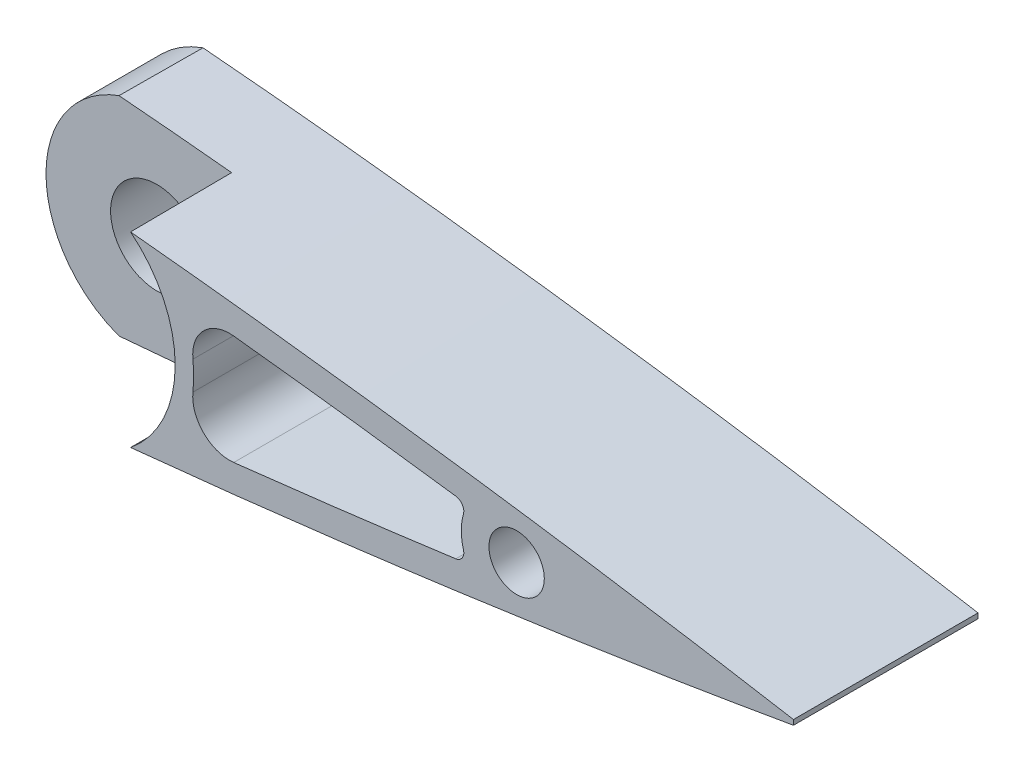
ISO-10303-21;
HEADER;
FILE_DESCRIPTION(('STEP AP214'),'2;1');
FILE_NAME('part.step','',(''),(''),'','','');
FILE_SCHEMA(('AUTOMOTIVE_DESIGN { 1 0 10303 214 1 1 1 1 }'));
ENDSEC;
DATA;
#1=APPLICATION_CONTEXT('core data for automotive mechanical design processes');
#2=APPLICATION_PROTOCOL_DEFINITION('international standard','automotive_design',2000,#1);
#3=PRODUCT_CONTEXT('',#1,'mechanical');
#4=PRODUCT('Part','Part','',(#3));
#5=PRODUCT_RELATED_PRODUCT_CATEGORY('part','',(#4));
#6=PRODUCT_DEFINITION_FORMATION('','',#4);
#7=PRODUCT_DEFINITION_CONTEXT('part definition',#1,'design');
#8=PRODUCT_DEFINITION('design','',#6,#7);
#9=PRODUCT_DEFINITION_SHAPE('','',#8);
#10=(LENGTH_UNIT() NAMED_UNIT(*) SI_UNIT(.MILLI.,.METRE.));
#11=(NAMED_UNIT(*) PLANE_ANGLE_UNIT() SI_UNIT($,.RADIAN.));
#12=(NAMED_UNIT(*) SI_UNIT($,.STERADIAN.) SOLID_ANGLE_UNIT());
#13=UNCERTAINTY_MEASURE_WITH_UNIT(LENGTH_MEASURE(1.E-05),#10,'distance_accuracy_value','');
#14=(GEOMETRIC_REPRESENTATION_CONTEXT(3) GLOBAL_UNCERTAINTY_ASSIGNED_CONTEXT((#13)) GLOBAL_UNIT_ASSIGNED_CONTEXT((#10,
#11,#12)) REPRESENTATION_CONTEXT('',''));
#15=CARTESIAN_POINT('',(0.,0.,0.));
#16=DIRECTION('',(0.,0.,1.));
#17=DIRECTION('',(1.,0.,0.));
#18=AXIS2_PLACEMENT_3D('',#15,#16,#17);
#19=CARTESIAN_POINT('',(-40.9948576917224,5.65866970142062,0.));
#20=CARTESIAN_POINT('',(-41.1047681248967,5.61871436722129,10.));
#21=CARTESIAN_POINT('',(-47.4055594104204,3.39869725070977,0.));
#22=CARTESIAN_POINT('',(-47.2891726596624,3.30203893481651,10.));
#23=CARTESIAN_POINT('',(-47.4055594105346,-3.39869725042733,0.));
#24=CARTESIAN_POINT('',(-47.2891726596455,-3.30203893485913,10.));
#25=CARTESIAN_POINT('',(-40.9948576919126,-5.6586697013536,0.));
#26=CARTESIAN_POINT('',(-41.1047681248678,-5.61871436723212,10.));
#27=(BOUNDED_SURFACE() B_SPLINE_SURFACE(3,1,((#19,#20),(#21,#22),(#23,#24),(#25,#26)),
.UNSPECIFIED.,.F.,.F.,.F.) B_SPLINE_SURFACE_WITH_KNOTS((4,4),(2,2),(0.,1.),(0.,1.),
.UNSPECIFIED.) GEOMETRIC_REPRESENTATION_ITEM() RATIONAL_B_SPLINE_SURFACE(((1.,1.),
(0.554984187979723,0.567196458320245),(0.554984187979723,0.567196458320245),(1.,1.))) REPRESENTATION_ITEM('') SURFACE());
#28=DIRECTION('',(-0.0109902917648385,0.00399526021097337,0.999931623353702));
#29=VECTOR('',#28,1.);
#30=CARTESIAN_POINT('',(-41.0498129083902,-5.63869203429286,5.));
#31=LINE('',#30,#29);
#32=CARTESIAN_POINT('',(-40.9948576919126,-5.65866970135359,0.));
#33=VERTEX_POINT('',#32);
#34=CARTESIAN_POINT('',(-41.0443173867424,-5.64068980099893,4.5));
#35=VERTEX_POINT('',#34);
#36=EDGE_CURVE('E447',#33,#35,#31,.T.);
#37=CARTESIAN_POINT('',(-41.0443173867424,-5.64068980099893,4.5));
#38=CARTESIAN_POINT('',(-41.2029787283233,-5.58321266238251,4.5));
#39=CARTESIAN_POINT('',(-41.3592000566172,-5.51900992495319,4.5));
#40=CARTESIAN_POINT('',(-41.6656772125908,-5.37768582411472,4.5));
#41=CARTESIAN_POINT('',(-41.8159333240919,-5.30056507625015,4.5));
#42=CARTESIAN_POINT('',(-42.1093073917876,-5.13399014906312,4.5));
#43=CARTESIAN_POINT('',(-42.2524302609352,-5.04454462273975,4.5));
#44=CARTESIAN_POINT('',(-42.5306341271626,-4.85392084998433,4.5));
#45=CARTESIAN_POINT('',(-42.665715222412,-4.75274274682159,4.5));
#46=CARTESIAN_POINT('',(-42.9269145382488,-4.53933954442495,4.5));
#47=CARTESIAN_POINT('',(-43.0530301734367,-4.42711128069352,4.5));
#48=CARTESIAN_POINT('',(-43.2954042491617,-4.19238665314542,4.5));
#49=CARTESIAN_POINT('',(-43.4116590306164,-4.06988651096669,4.5));
#50=CARTESIAN_POINT('',(-43.6333689978865,-3.8155975353294,4.5));
#51=CARTESIAN_POINT('',(-43.7388302788178,-3.68381401600102,4.5));
#52=CARTESIAN_POINT('',(-43.9383158222019,-3.41178267756264,4.5));
#53=CARTESIAN_POINT('',(-44.0323358493603,-3.27153175257937,4.5));
#54=CARTESIAN_POINT('',(-44.2081909822555,-2.98366226584791,4.5));
#55=CARTESIAN_POINT('',(-44.2900307477082,-2.83604655060197,4.5));
#56=CARTESIAN_POINT('',(-44.441014675281,-2.53439099852572,4.5));
#57=CARTESIAN_POINT('',(-44.5101541387605,-2.38034880989819,4.5));
#58=CARTESIAN_POINT('',(-44.635194859,-2.06702054593191,4.5));
#59=CARTESIAN_POINT('',(-44.6910989573736,-1.90773560458457,4.5));
#60=CARTESIAN_POINT('',(-44.7893086837632,-1.58496311407236,4.5));
#61=CARTESIAN_POINT('',(-44.8316092982534,-1.42147403940422,4.5));
#62=CARTESIAN_POINT('',(-44.9022668839468,-1.09158759943807,4.5));
#63=CARTESIAN_POINT('',(-44.9306301614375,-0.925191584814896,4.5));
#64=CARTESIAN_POINT('',(-44.9732474822588,-0.59054354297316,4.5));
#65=CARTESIAN_POINT('',(-44.9874966167167,-0.422290890577029,4.5));
#66=CARTESIAN_POINT('',(-45.0017653727376,-0.0852222494450081,4.5));
#67=CARTESIAN_POINT('',(-45.0017882773243,0.0835936003277888,4.5));
#68=CARTESIAN_POINT('',(-44.9876126431121,0.420627145444089,4.5));
#69=CARTESIAN_POINT('',(-44.9734141044544,0.588844840793534,4.5));
#70=CARTESIAN_POINT('',(-44.9308922323424,0.923520080554931,4.5));
#71=CARTESIAN_POINT('',(-44.90256604068,1.08997726183005,4.5));
#72=CARTESIAN_POINT('',(-44.83200127376,1.4198555460239,4.5));
#73=CARTESIAN_POINT('',(-44.7897675378456,1.5832776841661,4.5));
#74=CARTESIAN_POINT('',(-44.6916699506041,1.90603451970287,4.5));
#75=CARTESIAN_POINT('',(-44.6358018383275,2.06536792206897,4.5));
#76=CARTESIAN_POINT('',(-44.5108627948793,2.37870331303613,4.5));
#77=CARTESIAN_POINT('',(-44.44179672924,2.53270724175574,4.5));
#78=CARTESIAN_POINT('',(-44.2909231243759,2.83438356239696,4.5));
#79=CARTESIAN_POINT('',(-44.2091128442862,2.98205458358372,4.5));
#80=CARTESIAN_POINT('',(-44.033375820723,3.26992687955399,4.5));
#81=CARTESIAN_POINT('',(-43.939453557196,3.41013088925647,4.5));
#82=CARTESIAN_POINT('',(-43.7400621650187,3.6822332701832,4.5));
#83=CARTESIAN_POINT('',(-43.6345844985867,3.81412538522285,4.5));
#84=CARTESIAN_POINT('',(-43.4129308672798,4.06850496041743,4.5));
#85=CARTESIAN_POINT('',(-43.2967588659963,4.19099587427633,4.5));
#86=CARTESIAN_POINT('',(-43.0543755064491,4.42588647736764,4.5));
#87=CARTESIAN_POINT('',(-42.928153163707,4.53827483144716,4.5));
#88=CARTESIAN_POINT('',(-42.6667285449148,4.75196711716739,4.5));
#89=CARTESIAN_POINT('',(-42.5315296836153,4.85327522544987,4.5));
#90=CARTESIAN_POINT('',(-42.253260266547,5.04400768802192,4.5));
#91=CARTESIAN_POINT('',(-42.1102001920476,5.13344734764898,4.5));
#92=CARTESIAN_POINT('',(-41.8171169893318,5.29992861466415,4.5));
#93=CARTESIAN_POINT('',(-41.6670976529211,5.37697687370584,4.5));
#94=CARTESIAN_POINT('',(-41.4371842338413,5.48307626733985,4.5));
#95=CARTESIAN_POINT('',(-41.3594839707452,5.51695399823137,4.5));
#96=CARTESIAN_POINT('',(-41.2028335005848,5.5813412028403,4.5));
#97=CARTESIAN_POINT('',(-41.1238852956492,5.61185554763173,4.5));
#98=CARTESIAN_POINT('',(-41.0443173866508,5.64068980103092,4.5));
#99=B_SPLINE_CURVE_WITH_KNOTS('',3,(#37,#38,#39,#40,#41,#42,#43,#44,#45,#46,#47,#48,#49,#50,#51,
#52,#53,#54,#55,#56,#57,#58,#59,#60,#61,#62,#63,#64,#65,#66,#67,#68,#69,#70,#71,#72,#73,#74,#75,
#76,#77,#78,#79,#80,#81,#82,#83,#84,#85,#86,#87,#88,#89,#90,#91,#92,#93,#94,#95,#96,#97,#98),
.UNSPECIFIED.,.F.,.F.,(4,2,2,2,2,2,2,2,2,2,2,2,2,2,2,2,2,2,2,2,2,2,2,2,2,2,2,2,2,2,4),(0.,
0.506099776824991,1.01217544479851,1.51789759980682,2.02361357997118,2.52947480847549,
3.03552293391158,3.54128369743823,4.04723111633107,4.55298447822737,5.05892457490393,
5.56475594827675,6.07077353130984,6.57656194305414,7.08252620536402,7.5883737049542,
8.09422119951962,8.60017107515931,9.1059450834955,9.61187735674933,10.1176234725583,
10.6234785084119,11.129146973813,11.6351916079481,12.1410494384919,12.6474679400463,
13.1536948870201,13.6592625336143,14.1645578811373,14.4187857783768,14.6726405095199),.UNSPECIFIED.);
#100=CARTESIAN_POINT('',(-41.0443173866508,5.64068980103092,4.5));
#101=VERTEX_POINT('',#100);
#102=EDGE_CURVE('E341',#35,#101,#99,.T.);
#103=DIRECTION('',(0.0109902917867373,0.00399526021875701,-0.999931623353431));
#104=VECTOR('',#103,1.);
#105=CARTESIAN_POINT('',(-41.0498129083095,5.63869203432095,5.));
#106=LINE('',#105,#104);
#107=CARTESIAN_POINT('',(-40.9948576917224,5.65866970142062,0.));
#108=VERTEX_POINT('',#107);
#109=EDGE_CURVE('E221',#101,#108,#106,.T.);
#110=CARTESIAN_POINT('',(-39.,0.,0.));
#111=DIRECTION('',(0.,0.,1.));
#112=DIRECTION('',(1.,0.,0.));
#113=AXIS2_PLACEMENT_3D('',#110,#111,#112);
#114=CIRCLE('',#113,6.);
#115=EDGE_CURVE('E460',#108,#33,#114,.T.);
#116=ORIENTED_EDGE('',*,*,#36,.T.);
#117=ORIENTED_EDGE('',*,*,#102,.T.);
#118=ORIENTED_EDGE('',*,*,#109,.T.);
#119=ORIENTED_EDGE('',*,*,#115,.T.);
#120=EDGE_LOOP('',(#116,#117,#118,#119));
#121=FACE_BOUND('',#120,.T.);
#122=ADVANCED_FACE('F72',(#121),#27,.T.);
#123=CARTESIAN_POINT('',(-19.9933945924361,3.33135373290167,10.));
#124=DIRECTION('',(0.,0.,-1.));
#125=DIRECTION('',(-1.,0.,0.));
#126=AXIS2_PLACEMENT_3D('',#123,#124,#125);
#127=PLANE('',#126);
#128=CARTESIAN_POINT('',(-13.9999999999735,0.,10.));
#129=DIRECTION('',(0.,0.,-1.));
#130=DIRECTION('',(1.,0.,0.));
#131=AXIS2_PLACEMENT_3D('',#128,#129,#130);
#132=CIRCLE('',#131,3.);
#133=CARTESIAN_POINT('',(-16.8813350390833,-0.835409116779079,10.));
#134=VERTEX_POINT('',#133);
#135=CARTESIAN_POINT('',(-16.8813350390833,0.83540911677908,10.));
#136=VERTEX_POINT('',#135);
#137=EDGE_CURVE('E730',#134,#136,#132,.T.);
#138=ORIENTED_EDGE('',*,*,#137,.F.);
#139=CARTESIAN_POINT('',(-17.3615575456018,-0.974643969575621,10.));
#140=DIRECTION('',(0.,0.,-1.));
#141=DIRECTION('',(-1.,0.,0.));
#142=AXIS2_PLACEMENT_3D('',#139,#140,#141);
#143=CIRCLE('',#142,0.5);
#144=CARTESIAN_POINT('',(-17.2940529128367,-1.47007116894763,10.));
#145=VERTEX_POINT('',#144);
#146=EDGE_CURVE('E785',#134,#145,#143,.T.);
#147=ORIENTED_EDGE('',*,*,#146,.T.);
#148=CARTESIAN_POINT('',(-32.2583801629089,-3.28642084534359,10.));
#149=CARTESIAN_POINT('',(-30.0355019119028,-3.05174208210174,10.));
#150=CARTESIAN_POINT('',(-24.9412271101502,-2.47464776327198,10.));
#151=CARTESIAN_POINT('',(-19.7462553883482,-1.80661306170258,10.));
#152=CARTESIAN_POINT('',(-16.7717452962424,-1.39864830717587,10.));
#153=CARTESIAN_POINT('',(-16.6619182883872,-1.38355031796397,10.));
#154=B_SPLINE_CURVE_WITH_KNOTS('',3,(#148,#149,#150,#151,#152,#153),.UNSPECIFIED.,.F.,.F.,(4,1,
1,4),(0.0966403573735884,0.134580830221984,0.183660771534481,0.185542495339951),.UNSPECIFIED.);
#155=CARTESIAN_POINT('',(-29.3277461781608,-2.9674023842486,10.));
#156=VERTEX_POINT('',#155);
#157=EDGE_CURVE('E76',#145,#156,#154,.F.);
#158=ORIENTED_EDGE('',*,*,#157,.T.);
#159=CARTESIAN_POINT('',(-29.5506570415579,-0.979753874506312,10.));
#160=DIRECTION('',(0.,0.,-1.));
#161=DIRECTION('',(-1.,0.,0.));
#162=AXIS2_PLACEMENT_3D('',#159,#160,#161);
#163=CIRCLE('',#162,2.);
#164=CARTESIAN_POINT('',(-31.5399924012203,-0.773489900926037,10.));
#165=VERTEX_POINT('',#164);
#166=EDGE_CURVE('E83',#156,#165,#163,.T.);
#167=ORIENTED_EDGE('',*,*,#166,.T.);
#168=CARTESIAN_POINT('',(-38.999999999954,0.,10.));
#169=DIRECTION('',(0.,0.,-1.));
#170=DIRECTION('',(1.,0.,0.));
#171=AXIS2_PLACEMENT_3D('',#168,#169,#170);
#172=CIRCLE('',#171,7.5);
#173=CARTESIAN_POINT('',(-31.5399924012203,0.773489900926035,10.));
#174=VERTEX_POINT('',#173);
#175=EDGE_CURVE('E740',#174,#165,#172,.T.);
#176=ORIENTED_EDGE('',*,*,#175,.F.);
#177=CARTESIAN_POINT('',(-29.5506570415579,0.979753874506312,10.));
#178=DIRECTION('',(0.,0.,-1.));
#179=DIRECTION('',(-1.,0.,0.));
#180=AXIS2_PLACEMENT_3D('',#177,#178,#179);
#181=CIRCLE('',#180,2.);
#182=CARTESIAN_POINT('',(-29.3277461781608,2.9674023842486,10.));
#183=VERTEX_POINT('',#182);
#184=EDGE_CURVE('E826',#174,#183,#181,.T.);
#185=ORIENTED_EDGE('',*,*,#184,.T.);
#186=CARTESIAN_POINT('',(-16.6619182883872,1.38355031796397,10.));
#187=CARTESIAN_POINT('',(-16.7717452962424,1.39864830717587,10.));
#188=CARTESIAN_POINT('',(-19.7462553883482,1.80661306170258,10.));
#189=CARTESIAN_POINT('',(-24.9412271101502,2.47464776327198,10.));
#190=CARTESIAN_POINT('',(-30.0355019119028,3.05174208210174,10.));
#191=CARTESIAN_POINT('',(-32.2583801629089,3.28642084534359,10.));
#192=B_SPLINE_CURVE_WITH_KNOTS('',3,(#186,#187,#188,#189,#190,#191),.UNSPECIFIED.,.F.,.F.,(4,1,
1,4),(0.0966403573735884,0.0985220811790582,0.147602022491555,0.185542495339951),.UNSPECIFIED.);
#193=CARTESIAN_POINT('',(-17.2940529128367,1.47007116894762,10.));
#194=VERTEX_POINT('',#193);
#195=EDGE_CURVE('E269',#183,#194,#192,.F.);
#196=ORIENTED_EDGE('',*,*,#195,.T.);
#197=CARTESIAN_POINT('',(-17.3615575456017,0.974643969575606,10.));
#198=DIRECTION('',(0.,0.,-1.));
#199=DIRECTION('',(-1.,0.,0.));
#200=AXIS2_PLACEMENT_3D('',#197,#198,#199);
#201=CIRCLE('',#200,0.5);
#202=EDGE_CURVE('E776',#194,#136,#201,.T.);
#203=ORIENTED_EDGE('',*,*,#202,.T.);
#204=EDGE_LOOP('',(#138,#147,#158,#167,#176,#185,#196,#203));
#205=FACE_BOUND('',#204,.T.);
#206=CARTESIAN_POINT('',(-13.9999999999735,0.,10.));
#207=DIRECTION('',(0.,0.,1.));
#208=DIRECTION('',(1.,0.,0.));
#209=AXIS2_PLACEMENT_3D('',#206,#207,#208);
#210=CIRCLE('',#209,1.5);
#211=CARTESIAN_POINT('',(-12.4999999999734,0.,10.));
#212=VERTEX_POINT('',#211);
#213=EDGE_CURVE('E326',#212,#212,#210,.T.);
#214=ORIENTED_EDGE('',*,*,#213,.F.);
#215=EDGE_LOOP('',(#214));
#216=FACE_BOUND('',#215,.T.);
#217=CARTESIAN_POINT('',(1.00000000002645,0.135879999995553,10.));
#218=CARTESIAN_POINT('',(-0.43285857392012,0.382390442065448,10.));
#219=CARTESIAN_POINT('',(-3.29636544570968,0.875031068063019,10.));
#220=CARTESIAN_POINT('',(-9.02673756327685,1.79088543213333,10.));
#221=CARTESIAN_POINT('',(-16.1902386151355,2.84228751310894,10.));
#222=CARTESIAN_POINT('',(-24.7909587669283,3.96243144566577,10.));
#223=CARTESIAN_POINT('',(-33.0933579115919,4.90047334429686,10.));
#224=CARTESIAN_POINT('',(-38.5340455765228,5.40870914173916,10.));
#225=CARTESIAN_POINT('',(-41.1047681248967,5.61871436722129,10.));
#226=B_SPLINE_CURVE_WITH_KNOTS('',3,(#217,#218,#219,#220,#221,#222,#223,#224,#225),
.UNSPECIFIED.,.F.,.F.,(4,1,1,1,1,1,4),(0.,0.0246840231451877,0.0493299696040297,
0.0985220811790582,0.147602022491555,0.19657827575849,0.240367925910828),.UNSPECIFIED.);
#227=CARTESIAN_POINT('',(1.00000000002655,0.135879999995561,10.));
#228=VERTEX_POINT('',#227);
#229=CARTESIAN_POINT('',(-34.9176323389524,5.05808998338629,10.));
#230=VERTEX_POINT('',#229);
#231=EDGE_CURVE('E195',#228,#230,#226,.T.);
#232=ORIENTED_EDGE('',*,*,#231,.T.);
#233=CARTESIAN_POINT('',(-39.,0.,10.));
#234=DIRECTION('',(0.,0.,1.));
#235=DIRECTION('',(1.,0.,0.));
#236=AXIS2_PLACEMENT_3D('',#233,#234,#235);
#237=CIRCLE('',#236,6.5);
#238=CARTESIAN_POINT('',(-34.9175103800281,-5.0579915483146,10.));
#239=VERTEX_POINT('',#238);
#240=EDGE_CURVE('E177',#239,#230,#237,.T.);
#241=ORIENTED_EDGE('',*,*,#240,.F.);
#242=CARTESIAN_POINT('',(-41.1047681248678,-5.61871436723212,10.));
#243=CARTESIAN_POINT('',(-38.5340455765034,-5.40870914175028,10.));
#244=CARTESIAN_POINT('',(-33.0933579115819,-4.90047334430814,10.));
#245=CARTESIAN_POINT('',(-24.790958766928,-3.96243144567727,10.));
#246=CARTESIAN_POINT('',(-16.1902386151352,-2.84228751311959,10.));
#247=CARTESIAN_POINT('',(-9.02673756327671,-1.79088543214326,10.));
#248=CARTESIAN_POINT('',(-3.29636544570959,-0.875031068072371,10.));
#249=CARTESIAN_POINT('',(-0.432858573920109,-0.382390442074513,10.));
#250=CARTESIAN_POINT('',(1.00000000002642,-0.135880000004475,10.));
#251=B_SPLINE_CURVE_WITH_KNOTS('',3,(#242,#243,#244,#245,#246,#247,#248,#249,#250),
.UNSPECIFIED.,.F.,.F.,(4,1,1,1,1,1,4),(0.759632074089333,0.803421724241509,0.852397977508445,
0.901477918820942,0.95067003039597,0.975315976854812,1.),.UNSPECIFIED.);
#252=CARTESIAN_POINT('',(1.00000000002655,-0.135880000004439,10.));
#253=VERTEX_POINT('',#252);
#254=EDGE_CURVE('E209',#239,#253,#251,.T.);
#255=ORIENTED_EDGE('',*,*,#254,.T.);
#256=DIRECTION('',(0.,1.,0.));
#257=VECTOR('',#256,1.);
#258=CARTESIAN_POINT('',(1.00000000002655,0.135879999995561,10.));
#259=LINE('',#258,#257);
#260=EDGE_CURVE('E206',#253,#228,#259,.T.);
#261=ORIENTED_EDGE('',*,*,#260,.T.);
#262=EDGE_LOOP('',(#232,#241,#255,#261));
#263=FACE_BOUND('',#262,.T.);
#264=ADVANCED_FACE('F204',(#205,#216,#263),#127,.F.);
#265=CARTESIAN_POINT('',(-19.9398617873155,3.33750977083073,0.));
#266=DIRECTION('',(0.,0.,-1.));
#267=DIRECTION('',(-1.,0.,0.));
#268=AXIS2_PLACEMENT_3D('',#265,#266,#267);
#269=PLANE('',#268);
#270=CARTESIAN_POINT('',(-38.999999999954,0.,0.));
#271=DIRECTION('',(0.,0.,-1.));
#272=DIRECTION('',(-1.,0.,0.));
#273=AXIS2_PLACEMENT_3D('',#270,#271,#272);
#274=CIRCLE('',#273,2.5);
#275=CARTESIAN_POINT('',(-41.499999999954,0.,0.));
#276=VERTEX_POINT('',#275);
#277=EDGE_CURVE('E319',#276,#276,#274,.T.);
#278=ORIENTED_EDGE('',*,*,#277,.F.);
#279=EDGE_LOOP('',(#278));
#280=FACE_BOUND('',#279,.T.);
#281=CARTESIAN_POINT('',(-32.2583801629089,-3.28642084534359,0.));
#282=CARTESIAN_POINT('',(-30.0355019119028,-3.05174208210174,0.));
#283=CARTESIAN_POINT('',(-24.9412271101502,-2.47464776327198,0.));
#284=CARTESIAN_POINT('',(-19.7462553883482,-1.80661306170258,0.));
#285=CARTESIAN_POINT('',(-16.7717452962424,-1.39864830717587,0.));
#286=CARTESIAN_POINT('',(-16.6619182883872,-1.38355031796397,0.));
#287=B_SPLINE_CURVE_WITH_KNOTS('',3,(#281,#282,#283,#284,#285,#286),.UNSPECIFIED.,.F.,.F.,(4,1,
1,4),(0.0966403573735884,0.134580830221984,0.183660771534481,0.185542495339951),.UNSPECIFIED.);
#288=CARTESIAN_POINT('',(-17.2940535861858,-1.47006622933305,0.));
#289=VERTEX_POINT('',#288);
#290=CARTESIAN_POINT('',(-29.3277582953942,-2.96729410025235,0.));
#291=VERTEX_POINT('',#290);
#292=EDGE_CURVE('E748',#289,#291,#287,.F.);
#293=ORIENTED_EDGE('',*,*,#292,.F.);
#294=CARTESIAN_POINT('',(-17.3615575456018,-0.974643969575621,0.));
#295=DIRECTION('',(0.,0.,-1.));
#296=DIRECTION('',(-1.,0.,0.));
#297=AXIS2_PLACEMENT_3D('',#294,#295,#296);
#298=CIRCLE('',#297,0.5);
#299=CARTESIAN_POINT('',(-16.8813350390833,-0.835409116779079,0.));
#300=VERTEX_POINT('',#299);
#301=EDGE_CURVE('E782',#289,#300,#298,.F.);
#302=ORIENTED_EDGE('',*,*,#301,.T.);
#303=CARTESIAN_POINT('',(-13.9999999999735,0.,0.));
#304=DIRECTION('',(0.,0.,-1.));
#305=DIRECTION('',(-1.,0.,0.));
#306=AXIS2_PLACEMENT_3D('',#303,#304,#305);
#307=CIRCLE('',#306,3.);
#308=CARTESIAN_POINT('',(-16.8813350390833,0.83540911677908,0.));
#309=VERTEX_POINT('',#308);
#310=EDGE_CURVE('E201',#309,#300,#307,.F.);
#311=ORIENTED_EDGE('',*,*,#310,.F.);
#312=CARTESIAN_POINT('',(-17.3615575456017,0.974643969575606,0.));
#313=DIRECTION('',(0.,0.,-1.));
#314=DIRECTION('',(-1.,0.,0.));
#315=AXIS2_PLACEMENT_3D('',#312,#313,#314);
#316=CIRCLE('',#315,0.5);
#317=CARTESIAN_POINT('',(-17.2940535861857,1.47006622933304,0.));
#318=VERTEX_POINT('',#317);
#319=EDGE_CURVE('E767',#309,#318,#316,.F.);
#320=ORIENTED_EDGE('',*,*,#319,.T.);
#321=CARTESIAN_POINT('',(-16.6619182883872,1.38355031796397,0.));
#322=CARTESIAN_POINT('',(-16.7717452962424,1.39864830717587,0.));
#323=CARTESIAN_POINT('',(-19.7462553883482,1.80661306170258,0.));
#324=CARTESIAN_POINT('',(-24.9412271101502,2.47464776327198,0.));
#325=CARTESIAN_POINT('',(-30.0355019119028,3.05174208210174,0.));
#326=CARTESIAN_POINT('',(-32.2583801629089,3.28642084534359,0.));
#327=B_SPLINE_CURVE_WITH_KNOTS('',3,(#321,#322,#323,#324,#325,#326),.UNSPECIFIED.,.F.,.F.,(4,1,
1,4),(0.0966403573735884,0.0985220811790582,0.147602022491555,0.185542495339951),.UNSPECIFIED.);
#328=CARTESIAN_POINT('',(-29.3277582953942,2.96729410025235,0.));
#329=VERTEX_POINT('',#328);
#330=EDGE_CURVE('E806',#329,#318,#327,.F.);
#331=ORIENTED_EDGE('',*,*,#330,.F.);
#332=CARTESIAN_POINT('',(-29.5506570415579,0.979753874506312,0.));
#333=DIRECTION('',(0.,0.,-1.));
#334=DIRECTION('',(-1.,0.,0.));
#335=AXIS2_PLACEMENT_3D('',#332,#333,#334);
#336=CIRCLE('',#335,2.);
#337=CARTESIAN_POINT('',(-31.5399924012203,0.773489900926035,0.));
#338=VERTEX_POINT('',#337);
#339=EDGE_CURVE('E825',#329,#338,#336,.F.);
#340=ORIENTED_EDGE('',*,*,#339,.T.);
#341=CARTESIAN_POINT('',(-38.999999999954,0.,0.));
#342=DIRECTION('',(0.,0.,-1.));
#343=DIRECTION('',(-1.,0.,0.));
#344=AXIS2_PLACEMENT_3D('',#341,#342,#343);
#345=CIRCLE('',#344,7.5);
#346=CARTESIAN_POINT('',(-31.5399924012203,-0.773489900926037,0.));
#347=VERTEX_POINT('',#346);
#348=EDGE_CURVE('E803',#347,#338,#345,.F.);
#349=ORIENTED_EDGE('',*,*,#348,.F.);
#350=CARTESIAN_POINT('',(-29.5506570415579,-0.979753874506312,0.));
#351=DIRECTION('',(0.,0.,-1.));
#352=DIRECTION('',(-1.,0.,0.));
#353=AXIS2_PLACEMENT_3D('',#350,#351,#352);
#354=CIRCLE('',#353,2.);
#355=EDGE_CURVE('E12',#347,#291,#354,.F.);
#356=ORIENTED_EDGE('',*,*,#355,.T.);
#357=EDGE_LOOP('',(#293,#302,#311,#320,#331,#340,#349,#356));
#358=FACE_BOUND('',#357,.T.);
#359=CARTESIAN_POINT('',(-13.9999999999735,0.,0.));
#360=DIRECTION('',(0.,0.,-1.));
#361=DIRECTION('',(-1.,0.,0.));
#362=AXIS2_PLACEMENT_3D('',#359,#360,#361);
#363=CIRCLE('',#362,1.5);
#364=CARTESIAN_POINT('',(-15.4999999999735,0.,0.));
#365=VERTEX_POINT('',#364);
#366=EDGE_CURVE('E190',#365,#365,#363,.T.);
#367=ORIENTED_EDGE('',*,*,#366,.F.);
#368=EDGE_LOOP('',(#367));
#369=FACE_BOUND('',#368,.T.);
#370=CARTESIAN_POINT('',(1.00000000000001,0.139039999915863,0.));
#371=CARTESIAN_POINT('',(-0.466180866363391,0.391283242967253,0.));
#372=CARTESIAN_POINT('',(-3.39628092121674,0.8953806277152,0.));
#373=CARTESIAN_POINT('',(-9.25991750663234,1.83253393049732,0.));
#374=CARTESIAN_POINT('',(-16.5900116062063,2.90838722267404,0.));
#375=CARTESIAN_POINT('',(-25.3907485057129,4.0545810141463,0.));
#376=CARTESIAN_POINT('',(-33.52423059684,4.9735379144891,0.));
#377=CARTESIAN_POINT('',(-38.7280316671741,5.46626809135779,0.));
#378=CARTESIAN_POINT('',(-40.9948576917224,5.65866970142062,0.));
#379=B_SPLINE_CURVE_WITH_KNOTS('',3,(#370,#371,#372,#373,#374,#375,#376,#377,#378),
.UNSPECIFIED.,.F.,.F.,(4,1,1,1,1,1,4),(0.,0.0246840231451877,0.0493299696040297,
0.0985220811790582,0.147602022491555,0.19657827575849,0.234323811394607),.UNSPECIFIED.);
#380=CARTESIAN_POINT('',(1.,0.139039999915864,0.));
#381=VERTEX_POINT('',#380);
#382=EDGE_CURVE('E464',#381,#108,#379,.T.);
#383=ORIENTED_EDGE('',*,*,#382,.F.);
#384=DIRECTION('',(0.,1.,0.));
#385=VECTOR('',#384,1.);
#386=CARTESIAN_POINT('',(1.,-0.139039999915864,0.));
#387=LINE('',#386,#385);
#388=CARTESIAN_POINT('',(1.,-0.139039999915864,0.));
#389=VERTEX_POINT('',#388);
#390=EDGE_CURVE('E453',#389,#381,#387,.T.);
#391=ORIENTED_EDGE('',*,*,#390,.F.);
#392=CARTESIAN_POINT('',(-40.9948576919126,-5.65866970135359,0.));
#393=CARTESIAN_POINT('',(-38.7280316673039,-5.46626809129129,0.));
#394=CARTESIAN_POINT('',(-33.524230596909,-4.97353791442821,0.));
#395=CARTESIAN_POINT('',(-25.3907485057206,-4.0545810140946,0.));
#396=CARTESIAN_POINT('',(-16.5900116062118,-2.90838722263959,0.));
#397=CARTESIAN_POINT('',(-9.25991750663566,-1.83253393047723,0.));
#398=CARTESIAN_POINT('',(-3.3962809212182,-0.89538062770659,0.));
#399=CARTESIAN_POINT('',(-0.466180866363876,-0.391283242964382,0.));
#400=CARTESIAN_POINT('',(1.,-0.139039999915864,0.));
#401=B_SPLINE_CURVE_WITH_KNOTS('',3,(#392,#393,#394,#395,#396,#397,#398,#399,#400),
.UNSPECIFIED.,.F.,.F.,(4,1,1,1,1,1,4),(0.765676188604397,0.803421724241509,0.852397977508445,
0.901477918820942,0.95067003039597,0.975315976854812,1.),.UNSPECIFIED.);
#402=EDGE_CURVE('E456',#33,#389,#401,.T.);
#403=ORIENTED_EDGE('',*,*,#402,.F.);
#404=ORIENTED_EDGE('',*,*,#115,.F.);
#405=EDGE_LOOP('',(#383,#391,#403,#404));
#406=FACE_BOUND('',#405,.T.);
#407=ADVANCED_FACE('F233',(#280,#358,#369,#406),#269,.T.);
#408=CARTESIAN_POINT('',(-40.9948576919126,-5.65866970135359,0.));
#409=CARTESIAN_POINT('',(-41.1047681248678,-5.61871436723212,10.));
#410=CARTESIAN_POINT('',(-36.9008729179456,-5.31118416274999,0.));
#411=CARTESIAN_POINT('',(-36.9995459103049,-5.28335413266661,10.));
#412=CARTESIAN_POINT('',(-32.8139887136455,-4.88740166539431,0.));
#413=CARTESIAN_POINT('',(-32.9014714799737,-4.86803372507649,9.99999999999995));
#414=CARTESIAN_POINT('',(-28.4809729797418,-4.39541965412599,0.));
#415=CARTESIAN_POINT('',(-28.557152251385,-4.38027898420405,9.99999999999997));
#416=CARTESIAN_POINT('',(-28.2307745102029,-4.36680172856677,0.));
#417=CARTESIAN_POINT('',(-28.3062930843916,-4.35194575675251,9.99999999999997));
#418=CARTESIAN_POINT('',(-18.2817564228313,-3.22053691700721,0.));
#419=CARTESIAN_POINT('',(-18.3306601210153,-3.21888903793779,10.));
#420=CARTESIAN_POINT('',(-8.62103577044075,-1.79425275019566,0.));
#421=CARTESIAN_POINT('',(-8.64490181266345,-1.79519868839375,10.));
#422=CARTESIAN_POINT('',(1.,-0.139039999915864,0.));
#423=CARTESIAN_POINT('',(1.00000000002642,-0.135880000004475,10.));
#424=B_SPLINE_SURFACE_WITH_KNOTS('',3,1,((#408,#409),(#410,#411),(#412,#413),(#414,#415),(#416,
#417),(#418,#419),(#420,#421),(#422,#423)),.UNSPECIFIED.,.F.,.F.,.F.,(4,2,2,4),(2,2),(0.,
0.290925068903144,0.308755117552244,1.),(0.,1.),.UNSPECIFIED.);
#425=CARTESIAN_POINT('',(-34.9422636934508,-5.07787121405347,4.5));
#426=CARTESIAN_POINT('',(-34.937796605992,-5.07430138760694,5.41666635464183));
#427=CARTESIAN_POINT('',(-34.9333537365658,-5.07074150797208,6.33333286454353));
#428=CARTESIAN_POINT('',(-34.9245164337645,-5.06364164231405,8.16666619787686));
#429=CARTESIAN_POINT('',(-34.9201220003894,-5.06010165629094,9.08333302130848));
#430=CARTESIAN_POINT('',(-34.9157517850472,-5.05657161707957,9.99999999999998));
#431=B_SPLINE_CURVE_WITH_KNOTS('',3,(#425,#426,#427,#428,#429,#430),.UNSPECIFIED.,.F.,.F.,(4,2,
4),(0.,2.75005256674562,5.50010514252186),.UNSPECIFIED.);
#432=CARTESIAN_POINT('',(-34.9422636934508,-5.07787121405347,4.5));
#433=VERTEX_POINT('',#432);
#434=EDGE_CURVE('E184',#433,#239,#431,.T.);
#435=CARTESIAN_POINT('',(-32.422,-4.81771820301119,4.5));
#436=CARTESIAN_POINT('',(-32.9005331575343,-4.86845017406593,4.5));
#437=CARTESIAN_POINT('',(-33.3791429455199,-4.91846319022716,4.5));
#438=CARTESIAN_POINT('',(-34.3365096646868,-5.01693393326302,4.5));
#439=CARTESIAN_POINT('',(-34.8152665916523,-5.06539170114022,4.5));
#440=CARTESIAN_POINT('',(-35.7729395142924,-5.16063654059283,4.5));
#441=CARTESIAN_POINT('',(-36.2518555074637,-5.20742363730965,4.5));
#442=CARTESIAN_POINT('',(-37.2098598870865,-5.29921183385194,4.5));
#443=CARTESIAN_POINT('',(-37.6889482739488,-5.34421292939266,4.5));
#444=CARTESIAN_POINT('',(-38.6473062155703,-5.43231332958169,4.5));
#445=CARTESIAN_POINT('',(-39.1265757725456,-5.47541261015311,4.5));
#446=CARTESIAN_POINT('',(-40.0853061390769,-5.55959374383883,4.5));
#447=CARTESIAN_POINT('',(-40.564766953839,-5.60067553763409,4.5));
#448=CARTESIAN_POINT('',(-41.0443173867424,-5.64068980099893,4.5));
#449=B_SPLINE_CURVE_WITH_KNOTS('',3,(#435,#436,#437,#438,#439,#440,#441,#442,#443,#444,#445,
#446,#447,#448),.UNSPECIFIED.,.F.,.F.,(4,2,2,2,2,2,4),(0.,1.44364456034382,2.88725102911458,
4.33083576432881,5.77442396259481,7.21803043137384,8.66167932033117),.UNSPECIFIED.);
#450=EDGE_CURVE('E339',#433,#35,#449,.T.);
#451=DIRECTION('',(2.64237403476633E-12,0.000315999975361642,0.999999950072007));
#452=VECTOR('',#451,1.);
#453=CARTESIAN_POINT('',(1.00000000001321,-0.13745999996017,5.));
#454=LINE('',#453,#452);
#455=EDGE_CURVE('E444',#389,#253,#454,.T.);
#456=ORIENTED_EDGE('',*,*,#434,.F.);
#457=ORIENTED_EDGE('',*,*,#450,.T.);
#458=ORIENTED_EDGE('',*,*,#36,.F.);
#459=ORIENTED_EDGE('',*,*,#402,.T.);
#460=ORIENTED_EDGE('',*,*,#455,.T.);
#461=ORIENTED_EDGE('',*,*,#254,.F.);
#462=EDGE_LOOP('',(#456,#457,#458,#459,#460,#461));
#463=FACE_BOUND('',#462,.T.);
#464=ADVANCED_FACE('F379',(#463),#424,.T.);
#465=CARTESIAN_POINT('',(1.00000000000001,0.139039999915863,0.));
#466=CARTESIAN_POINT('',(1.00000000002645,0.135879999995553,10.));
#467=CARTESIAN_POINT('',(-8.2772834822999,1.73511325797625,0.));
#468=CARTESIAN_POINT('',(-8.30029680652431,1.73591249367664,10.));
#469=CARTESIAN_POINT('',(-17.5912398912053,3.1196254241921,0.));
#470=CARTESIAN_POINT('',(-17.6383561063308,3.11817046870563,9.99999999999998));
#471=CARTESIAN_POINT('',(-27.1824506187331,4.24458963623742,0.));
#472=CARTESIAN_POINT('',(-27.2551824383255,4.23099108925804,10.));
#473=CARTESIAN_POINT('',(-27.4236504771249,4.27268592386456,0.));
#474=CARTESIAN_POINT('',(-27.4970184394427,4.25882970531008,10.));
#475=CARTESIAN_POINT('',(-32.1021119407972,4.81386505149352,0.));
#476=CARTESIAN_POINT('',(-32.1876718596121,4.79582833488768,10.));
#477=CARTESIAN_POINT('',(-36.5443536380457,5.28092384168302,0.));
#478=CARTESIAN_POINT('',(-36.6420473128851,5.25414966887097,10.));
#479=CARTESIAN_POINT('',(-40.9948576917224,5.65866970142062,0.));
#480=CARTESIAN_POINT('',(-41.1047681248967,5.61871436722129,10.));
#481=B_SPLINE_SURFACE_WITH_KNOTS('',3,1,((#465,#466),(#467,#468),(#469,#470),(#471,#472),(#473,
#474),(#475,#476),(#477,#478),(#479,#480)),.UNSPECIFIED.,.F.,.F.,.F.,(4,2,2,4),(2,2),(0.,
0.666547229805847,0.683740224228843,1.),(0.,1.),.UNSPECIFIED.);
#482=CARTESIAN_POINT('',(-34.9159906412514,5.05676453452736,10.));
#483=CARTESIAN_POINT('',(-34.9203616733258,5.06029489271911,9.08333302345756));
#484=CARTESIAN_POINT('',(-34.924756975687,5.06383523492736,8.16666620259964));
#485=CARTESIAN_POINT('',(-34.933596120997,5.07093588738842,6.3333328692663));
#486=CARTESIAN_POINT('',(-34.9380399639461,5.0744961976413,5.41666635679089));
#487=CARTESIAN_POINT('',(-34.942508077182,5.07806649191074,4.50000000000001));
#488=B_SPLINE_CURVE_WITH_KNOTS('',3,(#482,#483,#484,#485,#486,#487),.UNSPECIFIED.,.F.,.F.,(4,2,
4),(0.,2.75005258468054,5.50010517832084),.UNSPECIFIED.);
#489=CARTESIAN_POINT('',(-34.942508077182,5.07806649191074,4.5));
#490=VERTEX_POINT('',#489);
#491=EDGE_CURVE('E181',#230,#490,#488,.T.);
#492=DIRECTION('',(2.65482067508503E-12,-0.000315999976253079,0.999999950072006));
#493=VECTOR('',#492,1.);
#494=CARTESIAN_POINT('',(1.,0.139039999915864,0.));
#495=LINE('',#494,#493);
#496=EDGE_CURVE('E210',#381,#228,#495,.T.);
#497=CARTESIAN_POINT('',(-41.0443173866508,5.64068980103092,4.5));
#498=CARTESIAN_POINT('',(-40.5647671916649,5.60067555525062,4.5));
#499=CARTESIAN_POINT('',(-40.0853057943202,5.55960308822448,4.5));
#500=CARTESIAN_POINT('',(-39.1265733974986,5.47545049789657,4.5));
#501=CARTESIAN_POINT('',(-38.6473023928221,5.43237043385997,4.5));
#502=CARTESIAN_POINT('',(-37.6889414547563,5.34430962861183,4.5));
#503=CARTESIAN_POINT('',(-37.2098515191165,5.29932891186418,4.5));
#504=CARTESIAN_POINT('',(-36.2518446149565,5.20757388671786,4.5));
#505=CARTESIAN_POINT('',(-35.7729276460535,5.16079958231375,4.5));
#506=CARTESIAN_POINT('',(-34.8152543460772,5.06556401852009,4.5));
#507=CARTESIAN_POINT('',(-34.3364980175379,5.01710273367731,4.5));
#508=CARTESIAN_POINT('',(-33.3791349678145,4.91859991064435,4.5));
#509=CARTESIAN_POINT('',(-32.9005282509696,4.8685583302659,4.5));
#510=CARTESIAN_POINT('',(-32.422,4.81778091815075,4.5));
#511=B_SPLINE_CURVE_WITH_KNOTS('',3,(#497,#498,#499,#500,#501,#502,#503,#504,#505,#506,#507,
#508,#509,#510),.UNSPECIFIED.,.F.,.F.,(4,2,2,2,2,2,4),(0.,1.44364825716936,2.88725392415336,
4.33084101570927,5.77442489238195,7.2180305593568,8.66167479809706),.UNSPECIFIED.);
#512=EDGE_CURVE('E199',#101,#490,#511,.T.);
#513=ORIENTED_EDGE('',*,*,#491,.F.);
#514=ORIENTED_EDGE('',*,*,#231,.F.);
#515=ORIENTED_EDGE('',*,*,#496,.F.);
#516=ORIENTED_EDGE('',*,*,#382,.T.);
#517=ORIENTED_EDGE('',*,*,#109,.F.);
#518=ORIENTED_EDGE('',*,*,#512,.T.);
#519=EDGE_LOOP('',(#513,#514,#515,#516,#517,#518));
#520=FACE_BOUND('',#519,.T.);
#521=ADVANCED_FACE('F194',(#520),#481,.T.);
#522=CARTESIAN_POINT('',(1.,0.,-2.65482080763491E-12));
#523=DIRECTION('',(-1.,0.,2.65482080763491E-12));
#524=DIRECTION('',(2.65482080763491E-12,0.,1.));
#525=AXIS2_PLACEMENT_3D('',#522,#523,#524);
#526=PLANE('',#525);
#527=ORIENTED_EDGE('',*,*,#496,.T.);
#528=ORIENTED_EDGE('',*,*,#260,.F.);
#529=ORIENTED_EDGE('',*,*,#455,.F.);
#530=ORIENTED_EDGE('',*,*,#390,.T.);
#531=EDGE_LOOP('',(#527,#528,#529,#530));
#532=FACE_BOUND('',#531,.T.);
#533=ADVANCED_FACE('F235',(#532),#526,.F.);
#534=CARTESIAN_POINT('',(-39.,0.,4.5));
#535=DIRECTION('',(0.,0.,1.));
#536=DIRECTION('',(1.,0.,0.));
#537=AXIS2_PLACEMENT_3D('',#534,#535,#536);
#538=CYLINDRICAL_SURFACE('',#537,6.5);
#539=ORIENTED_EDGE('',*,*,#434,.T.);
#540=ORIENTED_EDGE('',*,*,#240,.T.);
#541=ORIENTED_EDGE('',*,*,#491,.T.);
#542=CARTESIAN_POINT('',(-39.,0.,4.5));
#543=DIRECTION('',(0.,0.,1.));
#544=DIRECTION('',(1.,0.,0.));
#545=AXIS2_PLACEMENT_3D('',#542,#543,#544);
#546=CIRCLE('',#545,6.5);
#547=EDGE_CURVE('E189',#433,#490,#546,.T.);
#548=ORIENTED_EDGE('',*,*,#547,.F.);
#549=EDGE_LOOP('',(#539,#540,#541,#548));
#550=FACE_BOUND('',#549,.T.);
#551=ADVANCED_FACE('F179',(#550),#538,.F.);
#552=CARTESIAN_POINT('',(-39.,0.,4.5));
#553=DIRECTION('',(0.,0.,1.));
#554=DIRECTION('',(1.,0.,0.));
#555=AXIS2_PLACEMENT_3D('',#552,#553,#554);
#556=PLANE('',#555);
#557=CARTESIAN_POINT('',(-38.999999999954,0.,4.5));
#558=DIRECTION('',(0.,0.,1.));
#559=DIRECTION('',(1.,0.,0.));
#560=AXIS2_PLACEMENT_3D('',#557,#558,#559);
#561=CIRCLE('',#560,2.5);
#562=CARTESIAN_POINT('',(-36.499999999954,0.,4.5));
#563=VERTEX_POINT('',#562);
#564=EDGE_CURVE('E327',#563,#563,#561,.T.);
#565=ORIENTED_EDGE('',*,*,#564,.F.);
#566=EDGE_LOOP('',(#565));
#567=FACE_BOUND('',#566,.T.);
#568=ORIENTED_EDGE('',*,*,#547,.T.);
#569=ORIENTED_EDGE('',*,*,#512,.F.);
#570=ORIENTED_EDGE('',*,*,#102,.F.);
#571=ORIENTED_EDGE('',*,*,#450,.F.);
#572=EDGE_LOOP('',(#568,#569,#570,#571));
#573=FACE_BOUND('',#572,.T.);
#574=ADVANCED_FACE('F334',(#567,#573),#556,.T.);
#575=CARTESIAN_POINT('',(-13.9999999999735,0.,-0.110761062070624));
#576=DIRECTION('',(0.,0.,1.));
#577=DIRECTION('',(1.,0.,0.));
#578=AXIS2_PLACEMENT_3D('',#575,#576,#577);
#579=CYLINDRICAL_SURFACE('',#578,1.5);
#580=ORIENTED_EDGE('',*,*,#366,.T.);
#581=EDGE_LOOP('',(#580));
#582=FACE_BOUND('',#581,.T.);
#583=ORIENTED_EDGE('',*,*,#213,.T.);
#584=EDGE_LOOP('',(#583));
#585=FACE_BOUND('',#584,.T.);
#586=ADVANCED_FACE('F311',(#582,#585),#579,.F.);
#587=CARTESIAN_POINT('',(-32.2583801629089,-3.28642084534359,-0.110761062070624));
#588=CARTESIAN_POINT('',(-30.0355019119028,-3.05174208210174,-0.110761062070624));
#589=CARTESIAN_POINT('',(-24.9412271101502,-2.47464776327198,-0.110761062070624));
#590=CARTESIAN_POINT('',(-19.7462553883482,-1.80661306170258,-0.110761062070624));
#591=CARTESIAN_POINT('',(-16.7717452962424,-1.39864830717587,-0.110761062070624));
#592=CARTESIAN_POINT('',(-16.6619182883872,-1.38355031796397,-0.110761062070624));
#593=B_SPLINE_CURVE_WITH_KNOTS('',3,(#587,#588,#589,#590,#591,#592),.UNSPECIFIED.,.F.,.F.,(4,1,
1,4),(0.0966403573735884,0.134580830221984,0.183660771534481,0.185542495339951),.UNSPECIFIED.);
#594=DIRECTION('',(0.,0.,1.));
#595=VECTOR('',#594,1.);
#596=SURFACE_OF_LINEAR_EXTRUSION('',#593,#595);
#597=ORIENTED_EDGE('',*,*,#292,.T.);
#598=DIRECTION('',(0.,0.,1.));
#599=VECTOR('',#598,1.);
#600=CARTESIAN_POINT('',(-29.3277582953942,-2.96729410025235,0.));
#601=LINE('',#600,#599);
#602=EDGE_CURVE('E828',#291,#156,#601,.T.);
#603=ORIENTED_EDGE('',*,*,#602,.T.);
#604=ORIENTED_EDGE('',*,*,#157,.F.);
#605=DIRECTION('',(0.,0.,1.));
#606=VECTOR('',#605,1.);
#607=CARTESIAN_POINT('',(-17.2940535861858,-1.47006622933305,10.));
#608=LINE('',#607,#606);
#609=EDGE_CURVE('E750',#145,#289,#608,.F.);
#610=ORIENTED_EDGE('',*,*,#609,.T.);
#611=EDGE_LOOP('',(#597,#603,#604,#610));
#612=FACE_BOUND('',#611,.T.);
#613=ADVANCED_FACE('F307',(#612),#596,.F.);
#614=CARTESIAN_POINT('',(-38.999999999954,0.,-0.110761062070624));
#615=DIRECTION('',(0.,0.,1.));
#616=DIRECTION('',(1.,0.,0.));
#617=AXIS2_PLACEMENT_3D('',#614,#615,#616);
#618=CYLINDRICAL_SURFACE('',#617,7.5);
#619=ORIENTED_EDGE('',*,*,#348,.T.);
#620=DIRECTION('',(0.,0.,1.));
#621=VECTOR('',#620,1.);
#622=CARTESIAN_POINT('',(-31.5399924012203,0.773489900926035,-0.110761062070624));
#623=LINE('',#622,#621);
#624=EDGE_CURVE('E271',#338,#174,#623,.T.);
#625=ORIENTED_EDGE('',*,*,#624,.T.);
#626=ORIENTED_EDGE('',*,*,#175,.T.);
#627=DIRECTION('',(0.,0.,1.));
#628=VECTOR('',#627,1.);
#629=CARTESIAN_POINT('',(-31.5399924012203,-0.773489900926037,-0.110761062070624));
#630=LINE('',#629,#628);
#631=EDGE_CURVE('E769',#165,#347,#630,.F.);
#632=ORIENTED_EDGE('',*,*,#631,.T.);
#633=EDGE_LOOP('',(#619,#625,#626,#632));
#634=FACE_BOUND('',#633,.T.);
#635=ADVANCED_FACE('F302',(#634),#618,.T.);
#636=CARTESIAN_POINT('',(-16.6619182883872,1.38355031796397,-0.110761062070624));
#637=CARTESIAN_POINT('',(-16.7717452962424,1.39864830717587,-0.110761062070624));
#638=CARTESIAN_POINT('',(-19.7462553883482,1.80661306170258,-0.110761062070624));
#639=CARTESIAN_POINT('',(-24.9412271101502,2.47464776327198,-0.110761062070624));
#640=CARTESIAN_POINT('',(-30.0355019119028,3.05174208210174,-0.110761062070624));
#641=CARTESIAN_POINT('',(-32.2583801629089,3.28642084534359,-0.110761062070624));
#642=B_SPLINE_CURVE_WITH_KNOTS('',3,(#636,#637,#638,#639,#640,#641),.UNSPECIFIED.,.F.,.F.,(4,1,
1,4),(0.0966403573735884,0.0985220811790582,0.147602022491555,0.185542495339951),.UNSPECIFIED.);
#643=DIRECTION('',(0.,0.,1.));
#644=VECTOR('',#643,1.);
#645=SURFACE_OF_LINEAR_EXTRUSION('',#642,#644);
#646=ORIENTED_EDGE('',*,*,#195,.F.);
#647=DIRECTION('',(0.,0.,1.));
#648=VECTOR('',#647,1.);
#649=CARTESIAN_POINT('',(-29.3277582953942,2.96729410025235,10.));
#650=LINE('',#649,#648);
#651=EDGE_CURVE('E278',#183,#329,#650,.F.);
#652=ORIENTED_EDGE('',*,*,#651,.T.);
#653=ORIENTED_EDGE('',*,*,#330,.T.);
#654=DIRECTION('',(0.,0.,1.));
#655=VECTOR('',#654,1.);
#656=CARTESIAN_POINT('',(-17.2940535861857,1.47006622933304,0.));
#657=LINE('',#656,#655);
#658=EDGE_CURVE('E793',#318,#194,#657,.T.);
#659=ORIENTED_EDGE('',*,*,#658,.T.);
#660=EDGE_LOOP('',(#646,#652,#653,#659));
#661=FACE_BOUND('',#660,.T.);
#662=ADVANCED_FACE('F291',(#661),#645,.F.);
#663=CARTESIAN_POINT('',(-13.9999999999735,0.,-0.110761062070624));
#664=DIRECTION('',(0.,0.,1.));
#665=DIRECTION('',(1.,0.,0.));
#666=AXIS2_PLACEMENT_3D('',#663,#664,#665);
#667=CYLINDRICAL_SURFACE('',#666,3.);
#668=ORIENTED_EDGE('',*,*,#310,.T.);
#669=DIRECTION('',(0.,0.,1.));
#670=VECTOR('',#669,1.);
#671=CARTESIAN_POINT('',(-16.8813350390833,-0.835409116779079,-0.110761062070624));
#672=LINE('',#671,#670);
#673=EDGE_CURVE('E747',#300,#134,#672,.T.);
#674=ORIENTED_EDGE('',*,*,#673,.T.);
#675=ORIENTED_EDGE('',*,*,#137,.T.);
#676=DIRECTION('',(0.,0.,1.));
#677=VECTOR('',#676,1.);
#678=CARTESIAN_POINT('',(-16.8813350390833,0.83540911677908,-0.110761062070624));
#679=LINE('',#678,#677);
#680=EDGE_CURVE('E744',#136,#309,#679,.F.);
#681=ORIENTED_EDGE('',*,*,#680,.T.);
#682=EDGE_LOOP('',(#668,#674,#675,#681));
#683=FACE_BOUND('',#682,.T.);
#684=ADVANCED_FACE('F301',(#683),#667,.T.);
#685=CARTESIAN_POINT('',(-17.3615575456018,-0.974643969575621,5.));
#686=DIRECTION('',(0.,0.,1.));
#687=DIRECTION('',(1.,0.,0.));
#688=AXIS2_PLACEMENT_3D('',#685,#686,#687);
#689=CYLINDRICAL_SURFACE('',#688,0.5);
#690=ORIENTED_EDGE('',*,*,#301,.F.);
#691=ORIENTED_EDGE('',*,*,#609,.F.);
#692=ORIENTED_EDGE('',*,*,#146,.F.);
#693=ORIENTED_EDGE('',*,*,#673,.F.);
#694=EDGE_LOOP('',(#690,#691,#692,#693));
#695=FACE_BOUND('',#694,.T.);
#696=ADVANCED_FACE('F238',(#695),#689,.F.);
#697=CARTESIAN_POINT('',(-17.3615575456017,0.974643969575606,5.));
#698=DIRECTION('',(0.,0.,1.));
#699=DIRECTION('',(1.,0.,0.));
#700=AXIS2_PLACEMENT_3D('',#697,#698,#699);
#701=CYLINDRICAL_SURFACE('',#700,0.5);
#702=ORIENTED_EDGE('',*,*,#319,.F.);
#703=ORIENTED_EDGE('',*,*,#680,.F.);
#704=ORIENTED_EDGE('',*,*,#202,.F.);
#705=ORIENTED_EDGE('',*,*,#658,.F.);
#706=EDGE_LOOP('',(#702,#703,#704,#705));
#707=FACE_BOUND('',#706,.T.);
#708=ADVANCED_FACE('F578',(#707),#701,.F.);
#709=CARTESIAN_POINT('',(-29.5506570415579,0.979753874506312,5.));
#710=DIRECTION('',(0.,0.,1.));
#711=DIRECTION('',(1.,0.,0.));
#712=AXIS2_PLACEMENT_3D('',#709,#710,#711);
#713=CYLINDRICAL_SURFACE('',#712,2.);
#714=ORIENTED_EDGE('',*,*,#339,.F.);
#715=ORIENTED_EDGE('',*,*,#651,.F.);
#716=ORIENTED_EDGE('',*,*,#184,.F.);
#717=ORIENTED_EDGE('',*,*,#624,.F.);
#718=EDGE_LOOP('',(#714,#715,#716,#717));
#719=FACE_BOUND('',#718,.T.);
#720=ADVANCED_FACE('F609',(#719),#713,.F.);
#721=CARTESIAN_POINT('',(-29.5506570415579,-0.979753874506312,5.));
#722=DIRECTION('',(0.,0.,1.));
#723=DIRECTION('',(1.,0.,0.));
#724=AXIS2_PLACEMENT_3D('',#721,#722,#723);
#725=CYLINDRICAL_SURFACE('',#724,2.);
#726=ORIENTED_EDGE('',*,*,#355,.F.);
#727=ORIENTED_EDGE('',*,*,#631,.F.);
#728=ORIENTED_EDGE('',*,*,#166,.F.);
#729=ORIENTED_EDGE('',*,*,#602,.F.);
#730=EDGE_LOOP('',(#726,#727,#728,#729));
#731=FACE_BOUND('',#730,.T.);
#732=ADVANCED_FACE('F74',(#731),#725,.F.);
#733=CARTESIAN_POINT('',(-38.999999999954,0.,-0.110761062070625));
#734=DIRECTION('',(0.,0.,1.));
#735=DIRECTION('',(1.,0.,0.));
#736=AXIS2_PLACEMENT_3D('',#733,#734,#735);
#737=CYLINDRICAL_SURFACE('',#736,2.5);
#738=ORIENTED_EDGE('',*,*,#277,.T.);
#739=EDGE_LOOP('',(#738));
#740=FACE_BOUND('',#739,.T.);
#741=ORIENTED_EDGE('',*,*,#564,.T.);
#742=EDGE_LOOP('',(#741));
#743=FACE_BOUND('',#742,.T.);
#744=ADVANCED_FACE('F332',(#740,#743),#737,.F.);
#745=CLOSED_SHELL('',(#122,#264,#407,#464,#521,#533,#551,#574,#586,#613,#635,#662,#684,#696,
#708,#720,#732,#744));
#746=MANIFOLD_SOLID_BREP('B2',#745);
#747=ADVANCED_BREP_SHAPE_REPRESENTATION('',(#18,#746),#14);
#748=SHAPE_DEFINITION_REPRESENTATION(#9,#747);
ENDSEC;
END-ISO-10303-21;
